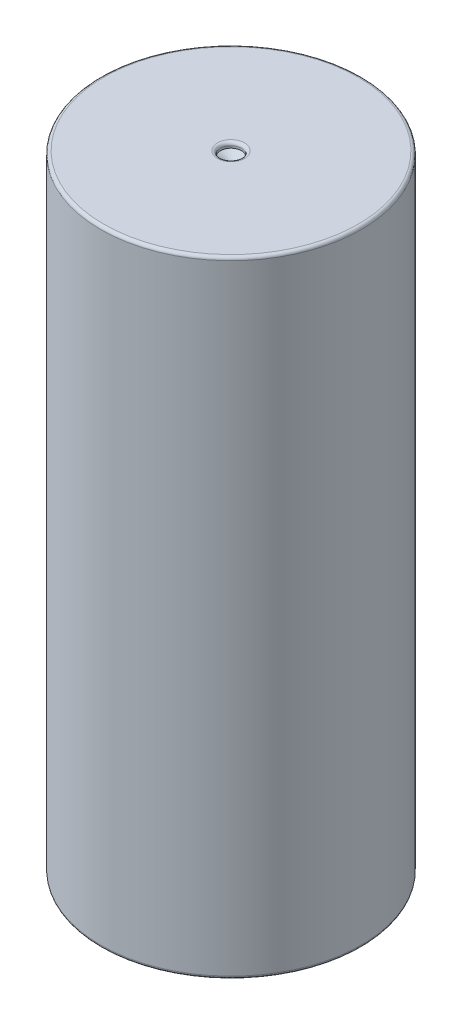
ISO-10303-21;
HEADER;
FILE_DESCRIPTION(('STEP AP214'),'2;1');
FILE_NAME('part.step','',(''),(''),'','','');
FILE_SCHEMA(('AUTOMOTIVE_DESIGN { 1 0 10303 214 1 1 1 1 }'));
ENDSEC;
DATA;
#1=APPLICATION_CONTEXT('core data for automotive mechanical design processes');
#2=APPLICATION_PROTOCOL_DEFINITION('international standard','automotive_design',2000,#1);
#3=PRODUCT_CONTEXT('',#1,'mechanical');
#4=PRODUCT('Part','Part','',(#3));
#5=PRODUCT_RELATED_PRODUCT_CATEGORY('part','',(#4));
#6=PRODUCT_DEFINITION_FORMATION('','',#4);
#7=PRODUCT_DEFINITION_CONTEXT('part definition',#1,'design');
#8=PRODUCT_DEFINITION('design','',#6,#7);
#9=PRODUCT_DEFINITION_SHAPE('','',#8);
#10=(LENGTH_UNIT() NAMED_UNIT(*) SI_UNIT(.MILLI.,.METRE.));
#11=(NAMED_UNIT(*) PLANE_ANGLE_UNIT() SI_UNIT($,.RADIAN.));
#12=(NAMED_UNIT(*) SI_UNIT($,.STERADIAN.) SOLID_ANGLE_UNIT());
#13=UNCERTAINTY_MEASURE_WITH_UNIT(LENGTH_MEASURE(1.E-05),#10,'distance_accuracy_value','');
#14=(GEOMETRIC_REPRESENTATION_CONTEXT(3) GLOBAL_UNCERTAINTY_ASSIGNED_CONTEXT((#13)) GLOBAL_UNIT_ASSIGNED_CONTEXT((#10,
#11,#12)) REPRESENTATION_CONTEXT('',''));
#15=CARTESIAN_POINT('',(0.,0.,0.));
#16=DIRECTION('',(0.,0.,1.));
#17=DIRECTION('',(1.,0.,0.));
#18=AXIS2_PLACEMENT_3D('',#15,#16,#17);
#19=CARTESIAN_POINT('',(12.5,30.,0.));
#20=DIRECTION('',(0.,-1.,0.));
#21=DIRECTION('',(0.,0.,-1.));
#22=AXIS2_PLACEMENT_3D('',#19,#20,#21);
#23=PLANE('',#22);
#24=CARTESIAN_POINT('',(0.,30.,0.));
#25=DIRECTION('',(0.,-1.,0.));
#26=DIRECTION('',(0.,0.,-1.));
#27=AXIS2_PLACEMENT_3D('',#24,#25,#26);
#28=CIRCLE('',#27,12.2);
#29=CARTESIAN_POINT('',(0.,30.,-12.2));
#30=VERTEX_POINT('',#29);
#31=EDGE_CURVE('E99',#30,#30,#28,.F.);
#32=ORIENTED_EDGE('',*,*,#31,.T.);
#33=EDGE_LOOP('',(#32));
#34=FACE_BOUND('',#33,.T.);
#35=CARTESIAN_POINT('',(0.,30.,0.));
#36=DIRECTION('',(0.,-1.,0.));
#37=DIRECTION('',(0.,0.,-1.));
#38=AXIS2_PLACEMENT_3D('',#35,#36,#37);
#39=CIRCLE('',#38,1.3);
#40=CARTESIAN_POINT('',(0.,30.,-1.3));
#41=VERTEX_POINT('',#40);
#42=EDGE_CURVE('E104',#41,#41,#39,.T.);
#43=ORIENTED_EDGE('',*,*,#42,.T.);
#44=EDGE_LOOP('',(#43));
#45=FACE_BOUND('',#44,.T.);
#46=ADVANCED_FACE('F33',(#34,#45),#23,.F.);
#47=CARTESIAN_POINT('',(0.,30.,0.));
#48=DIRECTION('',(0.,1.,0.));
#49=DIRECTION('',(0.,0.,1.));
#50=AXIS2_PLACEMENT_3D('',#47,#48,#49);
#51=CYLINDRICAL_SURFACE('',#50,12.5);
#52=CARTESIAN_POINT('',(0.,29.7,0.));
#53=DIRECTION('',(0.,-1.,0.));
#54=DIRECTION('',(0.,0.,-1.));
#55=AXIS2_PLACEMENT_3D('',#52,#53,#54);
#56=CIRCLE('',#55,12.5);
#57=CARTESIAN_POINT('',(0.,29.7,-12.5));
#58=VERTEX_POINT('',#57);
#59=EDGE_CURVE('E98',#58,#58,#56,.T.);
#60=ORIENTED_EDGE('',*,*,#59,.T.);
#61=EDGE_LOOP('',(#60));
#62=FACE_BOUND('',#61,.T.);
#63=CARTESIAN_POINT('',(0.,-29.7,0.));
#64=DIRECTION('',(0.,1.,0.));
#65=DIRECTION('',(0.,0.,1.));
#66=AXIS2_PLACEMENT_3D('',#63,#64,#65);
#67=CIRCLE('',#66,12.5);
#68=CARTESIAN_POINT('',(0.,-29.7,12.5));
#69=VERTEX_POINT('',#68);
#70=EDGE_CURVE('E96',#69,#69,#67,.T.);
#71=ORIENTED_EDGE('',*,*,#70,.T.);
#72=EDGE_LOOP('',(#71));
#73=FACE_BOUND('',#72,.T.);
#74=ADVANCED_FACE('F65',(#62,#73),#51,.T.);
#75=CARTESIAN_POINT('',(12.5,-30.,0.));
#76=DIRECTION('',(0.,1.,0.));
#77=DIRECTION('',(0.,0.,1.));
#78=AXIS2_PLACEMENT_3D('',#75,#76,#77);
#79=PLANE('',#78);
#80=CARTESIAN_POINT('',(0.,-30.,0.));
#81=DIRECTION('',(0.,1.,0.));
#82=DIRECTION('',(0.,0.,1.));
#83=AXIS2_PLACEMENT_3D('',#80,#81,#82);
#84=CIRCLE('',#83,12.2);
#85=CARTESIAN_POINT('',(0.,-30.,12.2));
#86=VERTEX_POINT('',#85);
#87=EDGE_CURVE('E41',#86,#86,#84,.F.);
#88=ORIENTED_EDGE('',*,*,#87,.T.);
#89=EDGE_LOOP('',(#88));
#90=FACE_BOUND('',#89,.T.);
#91=CARTESIAN_POINT('',(0.,-30.,0.));
#92=DIRECTION('',(0.,1.,0.));
#93=DIRECTION('',(0.,0.,1.));
#94=AXIS2_PLACEMENT_3D('',#91,#92,#93);
#95=CIRCLE('',#94,1.3);
#96=CARTESIAN_POINT('',(0.,-30.,1.3));
#97=VERTEX_POINT('',#96);
#98=EDGE_CURVE('E110',#97,#97,#95,.T.);
#99=ORIENTED_EDGE('',*,*,#98,.T.);
#100=EDGE_LOOP('',(#99));
#101=FACE_BOUND('',#100,.T.);
#102=ADVANCED_FACE('F71',(#90,#101),#79,.F.);
#103=CARTESIAN_POINT('',(0.,29.,0.));
#104=DIRECTION('',(0.,1.,0.));
#105=DIRECTION('',(-1.,0.,0.));
#106=AXIS2_PLACEMENT_3D('',#103,#104,#105);
#107=CONICAL_SURFACE('',#106,0.,1.10714871779409);
#108=CARTESIAN_POINT('',(0.,29.5,0.));
#109=DIRECTION('',(0.,1.,0.));
#110=DIRECTION('',(-1.,0.,0.));
#111=AXIS2_PLACEMENT_3D('',#108,#109,#110);
#112=CIRCLE('',#111,1.);
#113=CARTESIAN_POINT('',(-1.,29.5,0.));
#114=VERTEX_POINT('',#113);
#115=EDGE_CURVE('E126',#114,#114,#112,.T.);
#116=ORIENTED_EDGE('',*,*,#115,.T.);
#117=EDGE_LOOP('',(#116));
#118=FACE_BOUND('',#117,.T.);
#119=CARTESIAN_POINT('',(0.,29.,0.));
#120=VERTEX_POINT('',#119);
#121=VERTEX_LOOP('',#120);
#122=FACE_BOUND('',#121,.T.);
#123=ADVANCED_FACE('F60',(#118,#122),#107,.F.);
#124=CARTESIAN_POINT('',(0.,30.,0.));
#125=DIRECTION('',(0.,1.,0.));
#126=DIRECTION('',(-1.,0.,0.));
#127=AXIS2_PLACEMENT_3D('',#124,#125,#126);
#128=CYLINDRICAL_SURFACE('',#127,1.);
#129=CARTESIAN_POINT('',(0.,29.7,0.));
#130=DIRECTION('',(0.,-1.,0.));
#131=DIRECTION('',(0.,0.,-1.));
#132=AXIS2_PLACEMENT_3D('',#129,#130,#131);
#133=CIRCLE('',#132,1.);
#134=CARTESIAN_POINT('',(0.,29.7,-1.));
#135=VERTEX_POINT('',#134);
#136=EDGE_CURVE('E102',#135,#135,#133,.F.);
#137=ORIENTED_EDGE('',*,*,#136,.T.);
#138=EDGE_LOOP('',(#137));
#139=FACE_BOUND('',#138,.T.);
#140=ORIENTED_EDGE('',*,*,#115,.F.);
#141=EDGE_LOOP('',(#140));
#142=FACE_BOUND('',#141,.T.);
#143=ADVANCED_FACE('F50',(#139,#142),#128,.F.);
#144=CARTESIAN_POINT('',(0.,-29.,0.));
#145=DIRECTION('',(0.,-1.,0.));
#146=DIRECTION('',(-1.,0.,0.));
#147=AXIS2_PLACEMENT_3D('',#144,#145,#146);
#148=CONICAL_SURFACE('',#147,0.,1.10714871779409);
#149=CARTESIAN_POINT('',(0.,-29.5,0.));
#150=DIRECTION('',(0.,1.,0.));
#151=DIRECTION('',(-1.,0.,0.));
#152=AXIS2_PLACEMENT_3D('',#149,#150,#151);
#153=CIRCLE('',#152,1.);
#154=CARTESIAN_POINT('',(-1.,-29.5,0.));
#155=VERTEX_POINT('',#154);
#156=EDGE_CURVE('E128',#155,#155,#153,.T.);
#157=ORIENTED_EDGE('',*,*,#156,.F.);
#158=EDGE_LOOP('',(#157));
#159=FACE_BOUND('',#158,.T.);
#160=CARTESIAN_POINT('',(0.,-29.,0.));
#161=VERTEX_POINT('',#160);
#162=VERTEX_LOOP('',#161);
#163=FACE_BOUND('',#162,.T.);
#164=ADVANCED_FACE('F47',(#159,#163),#148,.F.);
#165=CARTESIAN_POINT('',(0.,-30.,0.));
#166=DIRECTION('',(0.,-1.,0.));
#167=DIRECTION('',(-1.,0.,0.));
#168=AXIS2_PLACEMENT_3D('',#165,#166,#167);
#169=CYLINDRICAL_SURFACE('',#168,1.);
#170=CARTESIAN_POINT('',(0.,-29.7,0.));
#171=DIRECTION('',(0.,1.,0.));
#172=DIRECTION('',(0.,0.,1.));
#173=AXIS2_PLACEMENT_3D('',#170,#171,#172);
#174=CIRCLE('',#173,1.);
#175=CARTESIAN_POINT('',(0.,-29.7,1.));
#176=VERTEX_POINT('',#175);
#177=EDGE_CURVE('E11',#176,#176,#174,.F.);
#178=ORIENTED_EDGE('',*,*,#177,.T.);
#179=EDGE_LOOP('',(#178));
#180=FACE_BOUND('',#179,.T.);
#181=ORIENTED_EDGE('',*,*,#156,.T.);
#182=EDGE_LOOP('',(#181));
#183=FACE_BOUND('',#182,.T.);
#184=ADVANCED_FACE('F49',(#180,#183),#169,.F.);
#185=CARTESIAN_POINT('',(0.,29.7,0.));
#186=DIRECTION('',(0.,-1.,0.));
#187=DIRECTION('',(0.,0.,-1.));
#188=AXIS2_PLACEMENT_3D('',#185,#186,#187);
#189=TOROIDAL_SURFACE('',#188,12.2,0.3);
#190=ORIENTED_EDGE('',*,*,#59,.F.);
#191=EDGE_LOOP('',(#190));
#192=FACE_BOUND('',#191,.T.);
#193=ORIENTED_EDGE('',*,*,#31,.F.);
#194=EDGE_LOOP('',(#193));
#195=FACE_BOUND('',#194,.T.);
#196=ADVANCED_FACE('F57',(#192,#195),#189,.T.);
#197=CARTESIAN_POINT('',(0.,29.7,0.));
#198=DIRECTION('',(0.,-1.,0.));
#199=DIRECTION('',(0.,0.,-1.));
#200=AXIS2_PLACEMENT_3D('',#197,#198,#199);
#201=TOROIDAL_SURFACE('',#200,1.3,0.3);
#202=ORIENTED_EDGE('',*,*,#42,.F.);
#203=EDGE_LOOP('',(#202));
#204=FACE_BOUND('',#203,.T.);
#205=ORIENTED_EDGE('',*,*,#136,.F.);
#206=EDGE_LOOP('',(#205));
#207=FACE_BOUND('',#206,.T.);
#208=ADVANCED_FACE('F80',(#204,#207),#201,.T.);
#209=CARTESIAN_POINT('',(0.,-29.7,0.));
#210=DIRECTION('',(0.,1.,0.));
#211=DIRECTION('',(0.,0.,1.));
#212=AXIS2_PLACEMENT_3D('',#209,#210,#211);
#213=TOROIDAL_SURFACE('',#212,12.2,0.3);
#214=ORIENTED_EDGE('',*,*,#87,.F.);
#215=EDGE_LOOP('',(#214));
#216=FACE_BOUND('',#215,.T.);
#217=ORIENTED_EDGE('',*,*,#70,.F.);
#218=EDGE_LOOP('',(#217));
#219=FACE_BOUND('',#218,.T.);
#220=ADVANCED_FACE('F83',(#216,#219),#213,.T.);
#221=CARTESIAN_POINT('',(0.,-29.7,0.));
#222=DIRECTION('',(0.,1.,0.));
#223=DIRECTION('',(0.,0.,1.));
#224=AXIS2_PLACEMENT_3D('',#221,#222,#223);
#225=TOROIDAL_SURFACE('',#224,1.3,0.3);
#226=ORIENTED_EDGE('',*,*,#177,.F.);
#227=EDGE_LOOP('',(#226));
#228=FACE_BOUND('',#227,.T.);
#229=ORIENTED_EDGE('',*,*,#98,.F.);
#230=EDGE_LOOP('',(#229));
#231=FACE_BOUND('',#230,.T.);
#232=ADVANCED_FACE('F35',(#228,#231),#225,.T.);
#233=CLOSED_SHELL('',(#46,#74,#102,#123,#143,#164,#184,#196,#208,#220,#232));
#234=MANIFOLD_SOLID_BREP('B2',#233);
#235=ADVANCED_BREP_SHAPE_REPRESENTATION('',(#18,#234),#14);
#236=SHAPE_DEFINITION_REPRESENTATION(#9,#235);
ENDSEC;
END-ISO-10303-21;
